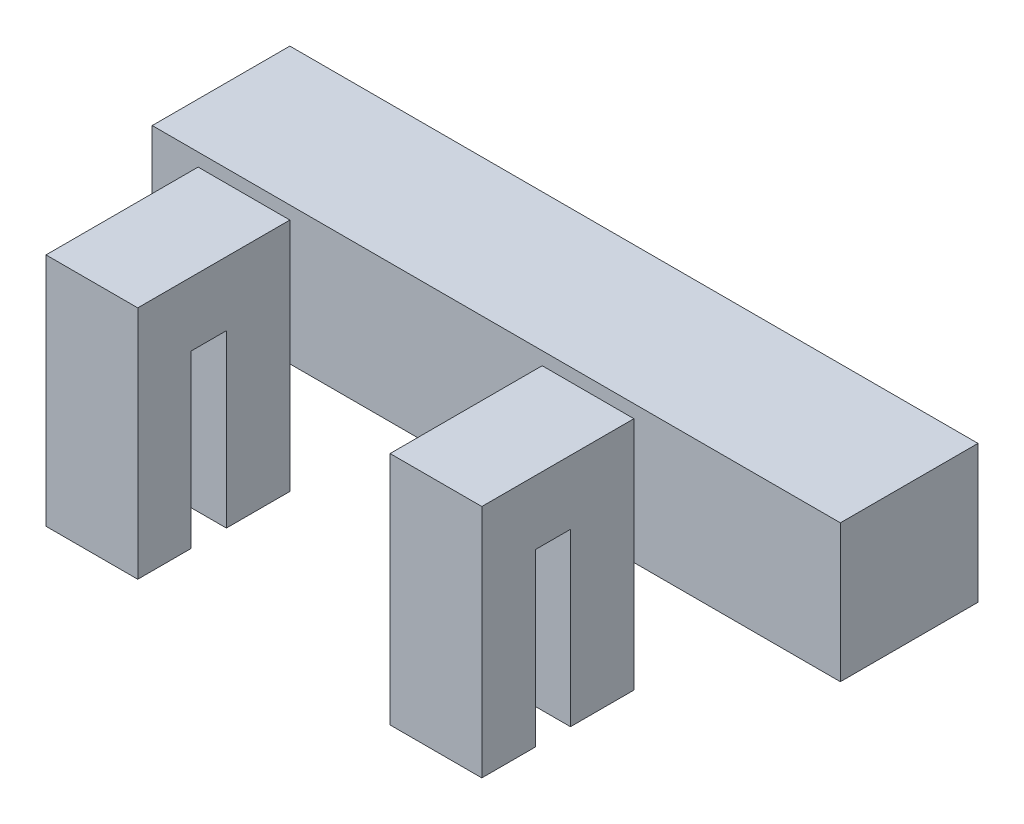
ISO-10303-21;
HEADER;
FILE_DESCRIPTION(('STEP AP214'),'2;1');
FILE_NAME('part.step','',(''),(''),'','','');
FILE_SCHEMA(('AUTOMOTIVE_DESIGN { 1 0 10303 214 1 1 1 1 }'));
ENDSEC;
DATA;
#1=APPLICATION_CONTEXT('core data for automotive mechanical design processes');
#2=APPLICATION_PROTOCOL_DEFINITION('international standard','automotive_design',2000,#1);
#3=PRODUCT_CONTEXT('',#1,'mechanical');
#4=PRODUCT('Part','Part','',(#3));
#5=PRODUCT_RELATED_PRODUCT_CATEGORY('part','',(#4));
#6=PRODUCT_DEFINITION_FORMATION('','',#4);
#7=PRODUCT_DEFINITION_CONTEXT('part definition',#1,'design');
#8=PRODUCT_DEFINITION('design','',#6,#7);
#9=PRODUCT_DEFINITION_SHAPE('','',#8);
#10=(LENGTH_UNIT() NAMED_UNIT(*) SI_UNIT(.MILLI.,.METRE.));
#11=(NAMED_UNIT(*) PLANE_ANGLE_UNIT() SI_UNIT($,.RADIAN.));
#12=(NAMED_UNIT(*) SI_UNIT($,.STERADIAN.) SOLID_ANGLE_UNIT());
#13=UNCERTAINTY_MEASURE_WITH_UNIT(LENGTH_MEASURE(1.E-05),#10,'distance_accuracy_value','');
#14=(GEOMETRIC_REPRESENTATION_CONTEXT(3) GLOBAL_UNCERTAINTY_ASSIGNED_CONTEXT((#13)) GLOBAL_UNIT_ASSIGNED_CONTEXT((#10,
#11,#12)) REPRESENTATION_CONTEXT('',''));
#15=CARTESIAN_POINT('',(0.,0.,0.));
#16=DIRECTION('',(0.,0.,1.));
#17=DIRECTION('',(1.,0.,0.));
#18=AXIS2_PLACEMENT_3D('',#15,#16,#17);
#19=CARTESIAN_POINT('',(0.,0.,30.));
#20=DIRECTION('',(0.,0.,1.));
#21=DIRECTION('',(1.,0.,0.));
#22=AXIS2_PLACEMENT_3D('',#19,#20,#21);
#23=PLANE('',#22);
#24=DIRECTION('',(-1.,0.,0.));
#25=VECTOR('',#24,1.);
#26=CARTESIAN_POINT('',(-45.,27.1581703390217,30.));
#27=LINE('',#26,#25);
#28=CARTESIAN_POINT('',(-45.,27.1581703390217,30.));
#29=VERTEX_POINT('',#28);
#30=CARTESIAN_POINT('',(-65.,27.1581703390217,30.));
#31=VERTEX_POINT('',#30);
#32=EDGE_CURVE('E48',#29,#31,#27,.T.);
#33=ORIENTED_EDGE('',*,*,#32,.F.);
#34=DIRECTION('',(0.,-1.,0.));
#35=VECTOR('',#34,1.);
#36=CARTESIAN_POINT('',(-45.,27.1581703390217,30.));
#37=LINE('',#36,#35);
#38=CARTESIAN_POINT('',(-45.,0.,30.));
#39=VERTEX_POINT('',#38);
#40=EDGE_CURVE('E191',#29,#39,#37,.T.);
#41=ORIENTED_EDGE('',*,*,#40,.T.);
#42=DIRECTION('',(1.,0.,0.));
#43=VECTOR('',#42,1.);
#44=CARTESIAN_POINT('',(0.,0.,30.));
#45=LINE('',#44,#43);
#46=CARTESIAN_POINT('',(0.,0.,30.));
#47=VERTEX_POINT('',#46);
#48=EDGE_CURVE('E333',#39,#47,#45,.T.);
#49=ORIENTED_EDGE('',*,*,#48,.T.);
#50=DIRECTION('',(0.,1.,0.));
#51=VECTOR('',#50,1.);
#52=CARTESIAN_POINT('',(0.,0.,30.));
#53=LINE('',#52,#51);
#54=CARTESIAN_POINT('',(0.,30.,30.));
#55=VERTEX_POINT('',#54);
#56=EDGE_CURVE('E325',#47,#55,#53,.T.);
#57=ORIENTED_EDGE('',*,*,#56,.T.);
#58=DIRECTION('',(-1.,0.,0.));
#59=VECTOR('',#58,1.);
#60=CARTESIAN_POINT('',(0.,30.,30.));
#61=LINE('',#60,#59);
#62=CARTESIAN_POINT('',(-150.,30.,30.));
#63=VERTEX_POINT('',#62);
#64=EDGE_CURVE('E328',#55,#63,#61,.T.);
#65=ORIENTED_EDGE('',*,*,#64,.T.);
#66=DIRECTION('',(0.,-1.,0.));
#67=VECTOR('',#66,1.);
#68=CARTESIAN_POINT('',(-150.,0.,30.));
#69=LINE('',#68,#67);
#70=CARTESIAN_POINT('',(-150.,0.,30.));
#71=VERTEX_POINT('',#70);
#72=EDGE_CURVE('E331',#63,#71,#69,.T.);
#73=ORIENTED_EDGE('',*,*,#72,.T.);
#74=CARTESIAN_POINT('',(-140.,0.,30.));
#75=VERTEX_POINT('',#74);
#76=EDGE_CURVE('E334',#71,#75,#45,.T.);
#77=ORIENTED_EDGE('',*,*,#76,.T.);
#78=DIRECTION('',(0.,-1.,0.));
#79=VECTOR('',#78,1.);
#80=CARTESIAN_POINT('',(-140.,27.1581703390217,30.));
#81=LINE('',#80,#79);
#82=CARTESIAN_POINT('',(-140.,27.1581703390217,30.));
#83=VERTEX_POINT('',#82);
#84=EDGE_CURVE('E284',#83,#75,#81,.T.);
#85=ORIENTED_EDGE('',*,*,#84,.F.);
#86=DIRECTION('',(-1.,0.,0.));
#87=VECTOR('',#86,1.);
#88=CARTESIAN_POINT('',(-120.,27.1581703390217,30.));
#89=LINE('',#88,#87);
#90=CARTESIAN_POINT('',(-120.,27.1581703390217,30.));
#91=VERTEX_POINT('',#90);
#92=EDGE_CURVE('E308',#91,#83,#89,.T.);
#93=ORIENTED_EDGE('',*,*,#92,.F.);
#94=DIRECTION('',(0.,-1.,0.));
#95=VECTOR('',#94,1.);
#96=CARTESIAN_POINT('',(-120.,27.1581703390217,30.));
#97=LINE('',#96,#95);
#98=CARTESIAN_POINT('',(-120.,0.,30.));
#99=VERTEX_POINT('',#98);
#100=EDGE_CURVE('E258',#91,#99,#97,.T.);
#101=ORIENTED_EDGE('',*,*,#100,.T.);
#102=CARTESIAN_POINT('',(-65.,0.,30.));
#103=VERTEX_POINT('',#102);
#104=EDGE_CURVE('E370',#99,#103,#45,.T.);
#105=ORIENTED_EDGE('',*,*,#104,.T.);
#106=DIRECTION('',(0.,-1.,0.));
#107=VECTOR('',#106,1.);
#108=CARTESIAN_POINT('',(-65.,27.1581703390217,30.));
#109=LINE('',#108,#107);
#110=EDGE_CURVE('E53',#31,#103,#109,.T.);
#111=ORIENTED_EDGE('',*,*,#110,.F.);
#112=EDGE_LOOP('',(#33,#41,#49,#57,#65,#73,#77,#85,#93,#101,#105,#111));
#113=FACE_BOUND('',#112,.T.);
#114=ADVANCED_FACE('F33',(#113),#23,.T.);
#115=CARTESIAN_POINT('',(0.,0.,30.));
#116=DIRECTION('',(-1.,0.,0.));
#117=DIRECTION('',(0.,-1.,0.));
#118=AXIS2_PLACEMENT_3D('',#115,#116,#117);
#119=PLANE('',#118);
#120=DIRECTION('',(0.,1.,0.));
#121=VECTOR('',#120,1.);
#122=CARTESIAN_POINT('',(0.,0.,0.));
#123=LINE('',#122,#121);
#124=CARTESIAN_POINT('',(0.,0.,0.));
#125=VERTEX_POINT('',#124);
#126=CARTESIAN_POINT('',(0.,30.,0.));
#127=VERTEX_POINT('',#126);
#128=EDGE_CURVE('E310',#125,#127,#123,.T.);
#129=ORIENTED_EDGE('',*,*,#128,.T.);
#130=DIRECTION('',(0.,0.,-1.));
#131=VECTOR('',#130,1.);
#132=CARTESIAN_POINT('',(0.,30.,30.));
#133=LINE('',#132,#131);
#134=EDGE_CURVE('E11',#55,#127,#133,.T.);
#135=ORIENTED_EDGE('',*,*,#134,.F.);
#136=ORIENTED_EDGE('',*,*,#56,.F.);
#137=DIRECTION('',(0.,0.,-1.));
#138=VECTOR('',#137,1.);
#139=CARTESIAN_POINT('',(0.,0.,30.));
#140=LINE('',#139,#138);
#141=EDGE_CURVE('E337',#47,#125,#140,.T.);
#142=ORIENTED_EDGE('',*,*,#141,.T.);
#143=EDGE_LOOP('',(#129,#135,#136,#142));
#144=FACE_BOUND('',#143,.T.);
#145=ADVANCED_FACE('F35',(#144),#119,.F.);
#146=CARTESIAN_POINT('',(0.,30.,30.));
#147=DIRECTION('',(0.,-1.,0.));
#148=DIRECTION('',(1.,0.,0.));
#149=AXIS2_PLACEMENT_3D('',#146,#147,#148);
#150=PLANE('',#149);
#151=DIRECTION('',(-1.,0.,0.));
#152=VECTOR('',#151,1.);
#153=CARTESIAN_POINT('',(0.,30.,0.));
#154=LINE('',#153,#152);
#155=CARTESIAN_POINT('',(-150.,30.,0.));
#156=VERTEX_POINT('',#155);
#157=EDGE_CURVE('E341',#127,#156,#154,.T.);
#158=ORIENTED_EDGE('',*,*,#157,.T.);
#159=DIRECTION('',(0.,0.,-1.));
#160=VECTOR('',#159,1.);
#161=CARTESIAN_POINT('',(-150.,30.,30.));
#162=LINE('',#161,#160);
#163=EDGE_CURVE('E41',#63,#156,#162,.T.);
#164=ORIENTED_EDGE('',*,*,#163,.F.);
#165=ORIENTED_EDGE('',*,*,#64,.F.);
#166=ORIENTED_EDGE('',*,*,#134,.T.);
#167=EDGE_LOOP('',(#158,#164,#165,#166));
#168=FACE_BOUND('',#167,.T.);
#169=ADVANCED_FACE('F417',(#168),#150,.F.);
#170=CARTESIAN_POINT('',(-150.,0.,30.));
#171=DIRECTION('',(1.,0.,0.));
#172=DIRECTION('',(0.,0.,-1.));
#173=AXIS2_PLACEMENT_3D('',#170,#171,#172);
#174=PLANE('',#173);
#175=DIRECTION('',(0.,-1.,0.));
#176=VECTOR('',#175,1.);
#177=CARTESIAN_POINT('',(-150.,0.,0.));
#178=LINE('',#177,#176);
#179=CARTESIAN_POINT('',(-150.,0.,0.));
#180=VERTEX_POINT('',#179);
#181=EDGE_CURVE('E343',#156,#180,#178,.T.);
#182=ORIENTED_EDGE('',*,*,#181,.T.);
#183=DIRECTION('',(0.,0.,-1.));
#184=VECTOR('',#183,1.);
#185=CARTESIAN_POINT('',(-150.,0.,30.));
#186=LINE('',#185,#184);
#187=EDGE_CURVE('E348',#71,#180,#186,.T.);
#188=ORIENTED_EDGE('',*,*,#187,.F.);
#189=ORIENTED_EDGE('',*,*,#72,.F.);
#190=ORIENTED_EDGE('',*,*,#163,.T.);
#191=EDGE_LOOP('',(#182,#188,#189,#190));
#192=FACE_BOUND('',#191,.T.);
#193=ADVANCED_FACE('F355',(#192),#174,.F.);
#194=CARTESIAN_POINT('',(0.,0.,30.));
#195=DIRECTION('',(0.,1.,0.));
#196=DIRECTION('',(-1.,0.,0.));
#197=AXIS2_PLACEMENT_3D('',#194,#195,#196);
#198=PLANE('',#197);
#199=DIRECTION('',(1.,0.,0.));
#200=VECTOR('',#199,1.);
#201=CARTESIAN_POINT('',(0.,0.,0.));
#202=LINE('',#201,#200);
#203=EDGE_CURVE('E329',#180,#125,#202,.T.);
#204=ORIENTED_EDGE('',*,*,#203,.T.);
#205=ORIENTED_EDGE('',*,*,#141,.F.);
#206=ORIENTED_EDGE('',*,*,#48,.F.);
#207=EDGE_CURVE('E188',#103,#39,#45,.T.);
#208=ORIENTED_EDGE('',*,*,#207,.F.);
#209=ORIENTED_EDGE('',*,*,#104,.F.);
#210=EDGE_CURVE('E338',#75,#99,#45,.T.);
#211=ORIENTED_EDGE('',*,*,#210,.F.);
#212=ORIENTED_EDGE('',*,*,#76,.F.);
#213=ORIENTED_EDGE('',*,*,#187,.T.);
#214=EDGE_LOOP('',(#204,#205,#206,#208,#209,#211,#212,#213));
#215=FACE_BOUND('',#214,.T.);
#216=ADVANCED_FACE('F364',(#215),#198,.F.);
#217=CARTESIAN_POINT('',(0.,0.,0.));
#218=DIRECTION('',(0.,0.,1.));
#219=DIRECTION('',(1.,0.,0.));
#220=AXIS2_PLACEMENT_3D('',#217,#218,#219);
#221=PLANE('',#220);
#222=ORIENTED_EDGE('',*,*,#128,.F.);
#223=ORIENTED_EDGE('',*,*,#203,.F.);
#224=ORIENTED_EDGE('',*,*,#181,.F.);
#225=ORIENTED_EDGE('',*,*,#157,.F.);
#226=EDGE_LOOP('',(#222,#223,#224,#225));
#227=FACE_BOUND('',#226,.T.);
#228=ADVANCED_FACE('F361',(#227),#221,.F.);
#229=CARTESIAN_POINT('',(-120.,27.1581703390217,30.));
#230=DIRECTION('',(0.,0.,-1.));
#231=DIRECTION('',(-1.,0.,0.));
#232=AXIS2_PLACEMENT_3D('',#229,#230,#231);
#233=PLANE('',#232);
#234=CARTESIAN_POINT('',(-140.,-24.0798332325672,30.));
#235=VERTEX_POINT('',#234);
#236=EDGE_CURVE('E246',#75,#235,#81,.T.);
#237=ORIENTED_EDGE('',*,*,#236,.F.);
#238=ORIENTED_EDGE('',*,*,#210,.T.);
#239=CARTESIAN_POINT('',(-120.,-24.0798332325672,30.));
#240=VERTEX_POINT('',#239);
#241=EDGE_CURVE('E262',#99,#240,#97,.T.);
#242=ORIENTED_EDGE('',*,*,#241,.T.);
#243=DIRECTION('',(-1.,0.,0.));
#244=VECTOR('',#243,1.);
#245=CARTESIAN_POINT('',(-120.,-24.0798332325672,30.));
#246=LINE('',#245,#244);
#247=EDGE_CURVE('E283',#240,#235,#246,.T.);
#248=ORIENTED_EDGE('',*,*,#247,.T.);
#249=EDGE_LOOP('',(#237,#238,#242,#248));
#250=FACE_BOUND('',#249,.T.);
#251=ADVANCED_FACE('F375',(#250),#233,.T.);
#252=CARTESIAN_POINT('',(-120.,27.1581703390217,30.));
#253=DIRECTION('',(0.,1.,0.));
#254=DIRECTION('',(0.,0.,1.));
#255=AXIS2_PLACEMENT_3D('',#252,#253,#254);
#256=PLANE('',#255);
#257=DIRECTION('',(0.,0.,-1.));
#258=VECTOR('',#257,1.);
#259=CARTESIAN_POINT('',(-140.,27.1581703390217,30.));
#260=LINE('',#259,#258);
#261=CARTESIAN_POINT('',(-140.,27.1581703390217,63.1561933360463));
#262=VERTEX_POINT('',#261);
#263=EDGE_CURVE('E305',#262,#83,#260,.T.);
#264=ORIENTED_EDGE('',*,*,#263,.F.);
#265=DIRECTION('',(-1.,0.,0.));
#266=VECTOR('',#265,1.);
#267=CARTESIAN_POINT('',(-120.,27.1581703390217,63.1561933360463));
#268=LINE('',#267,#266);
#269=CARTESIAN_POINT('',(-120.,27.1581703390217,63.1561933360463));
#270=VERTEX_POINT('',#269);
#271=EDGE_CURVE('E311',#270,#262,#268,.T.);
#272=ORIENTED_EDGE('',*,*,#271,.F.);
#273=DIRECTION('',(0.,0.,-1.));
#274=VECTOR('',#273,1.);
#275=CARTESIAN_POINT('',(-120.,27.1581703390217,30.));
#276=LINE('',#275,#274);
#277=EDGE_CURVE('E280',#270,#91,#276,.T.);
#278=ORIENTED_EDGE('',*,*,#277,.T.);
#279=ORIENTED_EDGE('',*,*,#92,.T.);
#280=EDGE_LOOP('',(#264,#272,#278,#279));
#281=FACE_BOUND('',#280,.T.);
#282=ADVANCED_FACE('F450',(#281),#256,.T.);
#283=CARTESIAN_POINT('',(-120.,27.1581703390217,63.1561933360463));
#284=DIRECTION('',(0.,0.,1.));
#285=DIRECTION('',(1.,0.,0.));
#286=AXIS2_PLACEMENT_3D('',#283,#284,#285);
#287=PLANE('',#286);
#288=DIRECTION('',(0.,1.,0.));
#289=VECTOR('',#288,1.);
#290=CARTESIAN_POINT('',(-140.,27.1581703390217,63.1561933360463));
#291=LINE('',#290,#289);
#292=CARTESIAN_POINT('',(-140.,-24.0798332325672,63.1561933360463));
#293=VERTEX_POINT('',#292);
#294=EDGE_CURVE('E302',#293,#262,#291,.T.);
#295=ORIENTED_EDGE('',*,*,#294,.F.);
#296=DIRECTION('',(-1.,0.,0.));
#297=VECTOR('',#296,1.);
#298=CARTESIAN_POINT('',(-120.,-24.0798332325672,63.1561933360463));
#299=LINE('',#298,#297);
#300=CARTESIAN_POINT('',(-120.,-24.0798332325672,63.1561933360463));
#301=VERTEX_POINT('',#300);
#302=EDGE_CURVE('E313',#301,#293,#299,.T.);
#303=ORIENTED_EDGE('',*,*,#302,.F.);
#304=DIRECTION('',(0.,1.,0.));
#305=VECTOR('',#304,1.);
#306=CARTESIAN_POINT('',(-120.,27.1581703390217,63.1561933360463));
#307=LINE('',#306,#305);
#308=EDGE_CURVE('E277',#301,#270,#307,.T.);
#309=ORIENTED_EDGE('',*,*,#308,.T.);
#310=ORIENTED_EDGE('',*,*,#271,.T.);
#311=EDGE_LOOP('',(#295,#303,#309,#310));
#312=FACE_BOUND('',#311,.T.);
#313=ADVANCED_FACE('F456',(#312),#287,.T.);
#314=CARTESIAN_POINT('',(-120.,-24.0798332325672,51.5046134278178));
#315=DIRECTION('',(0.,-1.,0.));
#316=DIRECTION('',(0.,0.,-1.));
#317=AXIS2_PLACEMENT_3D('',#314,#315,#316);
#318=PLANE('',#317);
#319=DIRECTION('',(0.,0.,1.));
#320=VECTOR('',#319,1.);
#321=CARTESIAN_POINT('',(-140.,-24.0798332325672,51.5046134278178));
#322=LINE('',#321,#320);
#323=CARTESIAN_POINT('',(-140.,-24.0798332325672,51.5046134278178));
#324=VERTEX_POINT('',#323);
#325=EDGE_CURVE('E299',#324,#293,#322,.T.);
#326=ORIENTED_EDGE('',*,*,#325,.F.);
#327=DIRECTION('',(-1.,0.,0.));
#328=VECTOR('',#327,1.);
#329=CARTESIAN_POINT('',(-120.,-24.0798332325672,51.5046134278178));
#330=LINE('',#329,#328);
#331=CARTESIAN_POINT('',(-120.,-24.0798332325672,51.5046134278178));
#332=VERTEX_POINT('',#331);
#333=EDGE_CURVE('E315',#332,#324,#330,.T.);
#334=ORIENTED_EDGE('',*,*,#333,.F.);
#335=DIRECTION('',(0.,0.,1.));
#336=VECTOR('',#335,1.);
#337=CARTESIAN_POINT('',(-120.,-24.0798332325672,51.5046134278178));
#338=LINE('',#337,#336);
#339=EDGE_CURVE('E274',#332,#301,#338,.T.);
#340=ORIENTED_EDGE('',*,*,#339,.T.);
#341=ORIENTED_EDGE('',*,*,#302,.T.);
#342=EDGE_LOOP('',(#326,#334,#340,#341));
#343=FACE_BOUND('',#342,.T.);
#344=ADVANCED_FACE('F464',(#343),#318,.T.);
#345=CARTESIAN_POINT('',(-120.,-24.0798332325672,51.5046134278178));
#346=DIRECTION('',(0.,0.,-1.));
#347=DIRECTION('',(-1.,0.,0.));
#348=AXIS2_PLACEMENT_3D('',#345,#346,#347);
#349=PLANE('',#348);
#350=DIRECTION('',(0.,-1.,0.));
#351=VECTOR('',#350,1.);
#352=CARTESIAN_POINT('',(-140.,-24.0798332325672,51.5046134278178));
#353=LINE('',#352,#351);
#354=CARTESIAN_POINT('',(-140.,13.1907484614558,51.5046134278178));
#355=VERTEX_POINT('',#354);
#356=EDGE_CURVE('E296',#355,#324,#353,.T.);
#357=ORIENTED_EDGE('',*,*,#356,.F.);
#358=DIRECTION('',(-1.,0.,0.));
#359=VECTOR('',#358,1.);
#360=CARTESIAN_POINT('',(-120.,13.1907484614558,51.5046134278178));
#361=LINE('',#360,#359);
#362=CARTESIAN_POINT('',(-120.,13.1907484614558,51.5046134278178));
#363=VERTEX_POINT('',#362);
#364=EDGE_CURVE('E317',#363,#355,#361,.T.);
#365=ORIENTED_EDGE('',*,*,#364,.F.);
#366=DIRECTION('',(0.,-1.,0.));
#367=VECTOR('',#366,1.);
#368=CARTESIAN_POINT('',(-120.,-24.0798332325672,51.5046134278178));
#369=LINE('',#368,#367);
#370=EDGE_CURVE('E271',#363,#332,#369,.T.);
#371=ORIENTED_EDGE('',*,*,#370,.T.);
#372=ORIENTED_EDGE('',*,*,#333,.T.);
#373=EDGE_LOOP('',(#357,#365,#371,#372));
#374=FACE_BOUND('',#373,.T.);
#375=ADVANCED_FACE('F472',(#374),#349,.T.);
#376=CARTESIAN_POINT('',(-120.,13.1907484614558,43.8333869043878));
#377=DIRECTION('',(0.,-1.,0.));
#378=DIRECTION('',(0.,0.,-1.));
#379=AXIS2_PLACEMENT_3D('',#376,#377,#378);
#380=PLANE('',#379);
#381=DIRECTION('',(0.,0.,1.));
#382=VECTOR('',#381,1.);
#383=CARTESIAN_POINT('',(-140.,13.1907484614558,43.8333869043878));
#384=LINE('',#383,#382);
#385=CARTESIAN_POINT('',(-140.,13.1907484614558,43.8333869043878));
#386=VERTEX_POINT('',#385);
#387=EDGE_CURVE('E293',#386,#355,#384,.T.);
#388=ORIENTED_EDGE('',*,*,#387,.F.);
#389=DIRECTION('',(-1.,0.,0.));
#390=VECTOR('',#389,1.);
#391=CARTESIAN_POINT('',(-120.,13.1907484614558,43.8333869043878));
#392=LINE('',#391,#390);
#393=CARTESIAN_POINT('',(-120.,13.1907484614558,43.8333869043878));
#394=VERTEX_POINT('',#393);
#395=EDGE_CURVE('E319',#394,#386,#392,.T.);
#396=ORIENTED_EDGE('',*,*,#395,.F.);
#397=DIRECTION('',(0.,0.,1.));
#398=VECTOR('',#397,1.);
#399=CARTESIAN_POINT('',(-120.,13.1907484614558,43.8333869043878));
#400=LINE('',#399,#398);
#401=EDGE_CURVE('E268',#394,#363,#400,.T.);
#402=ORIENTED_EDGE('',*,*,#401,.T.);
#403=ORIENTED_EDGE('',*,*,#364,.T.);
#404=EDGE_LOOP('',(#388,#396,#402,#403));
#405=FACE_BOUND('',#404,.T.);
#406=ADVANCED_FACE('F480',(#405),#380,.T.);
#407=CARTESIAN_POINT('',(-120.,-24.0798332325672,43.8333869043878));
#408=DIRECTION('',(0.,0.,1.));
#409=DIRECTION('',(1.,0.,0.));
#410=AXIS2_PLACEMENT_3D('',#407,#408,#409);
#411=PLANE('',#410);
#412=DIRECTION('',(0.,1.,0.));
#413=VECTOR('',#412,1.);
#414=CARTESIAN_POINT('',(-140.,-24.0798332325672,43.8333869043878));
#415=LINE('',#414,#413);
#416=CARTESIAN_POINT('',(-140.,-24.0798332325672,43.8333869043878));
#417=VERTEX_POINT('',#416);
#418=EDGE_CURVE('E290',#417,#386,#415,.T.);
#419=ORIENTED_EDGE('',*,*,#418,.F.);
#420=DIRECTION('',(-1.,0.,0.));
#421=VECTOR('',#420,1.);
#422=CARTESIAN_POINT('',(-120.,-24.0798332325672,43.8333869043878));
#423=LINE('',#422,#421);
#424=CARTESIAN_POINT('',(-120.,-24.0798332325672,43.8333869043878));
#425=VERTEX_POINT('',#424);
#426=EDGE_CURVE('E321',#425,#417,#423,.T.);
#427=ORIENTED_EDGE('',*,*,#426,.F.);
#428=DIRECTION('',(0.,1.,0.));
#429=VECTOR('',#428,1.);
#430=CARTESIAN_POINT('',(-120.,-24.0798332325672,43.8333869043878));
#431=LINE('',#430,#429);
#432=EDGE_CURVE('E265',#425,#394,#431,.T.);
#433=ORIENTED_EDGE('',*,*,#432,.T.);
#434=ORIENTED_EDGE('',*,*,#395,.T.);
#435=EDGE_LOOP('',(#419,#427,#433,#434));
#436=FACE_BOUND('',#435,.T.);
#437=ADVANCED_FACE('F488',(#436),#411,.T.);
#438=CARTESIAN_POINT('',(-120.,-24.0798332325672,30.));
#439=DIRECTION('',(0.,-1.,0.));
#440=DIRECTION('',(0.,0.,-1.));
#441=AXIS2_PLACEMENT_3D('',#438,#439,#440);
#442=PLANE('',#441);
#443=DIRECTION('',(0.,0.,1.));
#444=VECTOR('',#443,1.);
#445=CARTESIAN_POINT('',(-140.,-24.0798332325672,30.));
#446=LINE('',#445,#444);
#447=EDGE_CURVE('E287',#235,#417,#446,.T.);
#448=ORIENTED_EDGE('',*,*,#447,.F.);
#449=ORIENTED_EDGE('',*,*,#247,.F.);
#450=DIRECTION('',(0.,0.,1.));
#451=VECTOR('',#450,1.);
#452=CARTESIAN_POINT('',(-120.,-24.0798332325672,30.));
#453=LINE('',#452,#451);
#454=EDGE_CURVE('E261',#240,#425,#453,.T.);
#455=ORIENTED_EDGE('',*,*,#454,.T.);
#456=ORIENTED_EDGE('',*,*,#426,.T.);
#457=EDGE_LOOP('',(#448,#449,#455,#456));
#458=FACE_BOUND('',#457,.T.);
#459=ADVANCED_FACE('F496',(#458),#442,.T.);
#460=CARTESIAN_POINT('',(-120.,0.,0.));
#461=DIRECTION('',(-1.,0.,0.));
#462=DIRECTION('',(0.,0.,1.));
#463=AXIS2_PLACEMENT_3D('',#460,#461,#462);
#464=PLANE('',#463);
#465=ORIENTED_EDGE('',*,*,#100,.F.);
#466=ORIENTED_EDGE('',*,*,#277,.F.);
#467=ORIENTED_EDGE('',*,*,#308,.F.);
#468=ORIENTED_EDGE('',*,*,#339,.F.);
#469=ORIENTED_EDGE('',*,*,#370,.F.);
#470=ORIENTED_EDGE('',*,*,#401,.F.);
#471=ORIENTED_EDGE('',*,*,#432,.F.);
#472=ORIENTED_EDGE('',*,*,#454,.F.);
#473=ORIENTED_EDGE('',*,*,#241,.F.);
#474=EDGE_LOOP('',(#465,#466,#467,#468,#469,#470,#471,#472,#473));
#475=FACE_BOUND('',#474,.T.);
#476=ADVANCED_FACE('F504',(#475),#464,.F.);
#477=CARTESIAN_POINT('',(-140.,0.,0.));
#478=DIRECTION('',(-1.,0.,0.));
#479=DIRECTION('',(0.,0.,1.));
#480=AXIS2_PLACEMENT_3D('',#477,#478,#479);
#481=PLANE('',#480);
#482=ORIENTED_EDGE('',*,*,#84,.T.);
#483=ORIENTED_EDGE('',*,*,#236,.T.);
#484=ORIENTED_EDGE('',*,*,#447,.T.);
#485=ORIENTED_EDGE('',*,*,#418,.T.);
#486=ORIENTED_EDGE('',*,*,#387,.T.);
#487=ORIENTED_EDGE('',*,*,#356,.T.);
#488=ORIENTED_EDGE('',*,*,#325,.T.);
#489=ORIENTED_EDGE('',*,*,#294,.T.);
#490=ORIENTED_EDGE('',*,*,#263,.T.);
#491=EDGE_LOOP('',(#482,#483,#484,#485,#486,#487,#488,#489,#490));
#492=FACE_BOUND('',#491,.T.);
#493=ADVANCED_FACE('F511',(#492),#481,.T.);
#494=CARTESIAN_POINT('',(-45.,27.1581703390217,30.));
#495=DIRECTION('',(0.,0.,-1.));
#496=DIRECTION('',(-1.,0.,0.));
#497=AXIS2_PLACEMENT_3D('',#494,#495,#496);
#498=PLANE('',#497);
#499=ORIENTED_EDGE('',*,*,#207,.T.);
#500=CARTESIAN_POINT('',(-45.,-24.0798332325672,30.));
#501=VERTEX_POINT('',#500);
#502=EDGE_CURVE('E181',#39,#501,#37,.T.);
#503=ORIENTED_EDGE('',*,*,#502,.T.);
#504=DIRECTION('',(-1.,0.,0.));
#505=VECTOR('',#504,1.);
#506=CARTESIAN_POINT('',(-45.,-24.0798332325672,30.));
#507=LINE('',#506,#505);
#508=CARTESIAN_POINT('',(-65.,-24.0798332325672,30.));
#509=VERTEX_POINT('',#508);
#510=EDGE_CURVE('E185',#501,#509,#507,.T.);
#511=ORIENTED_EDGE('',*,*,#510,.T.);
#512=EDGE_CURVE('E226',#103,#509,#109,.T.);
#513=ORIENTED_EDGE('',*,*,#512,.F.);
#514=EDGE_LOOP('',(#499,#503,#511,#513));
#515=FACE_BOUND('',#514,.T.);
#516=ADVANCED_FACE('F183',(#515),#498,.T.);
#517=CARTESIAN_POINT('',(-45.,27.1581703390217,30.));
#518=DIRECTION('',(0.,1.,0.));
#519=DIRECTION('',(0.,0.,1.));
#520=AXIS2_PLACEMENT_3D('',#517,#518,#519);
#521=PLANE('',#520);
#522=DIRECTION('',(0.,0.,-1.));
#523=VECTOR('',#522,1.);
#524=CARTESIAN_POINT('',(-65.,27.1581703390217,30.));
#525=LINE('',#524,#523);
#526=CARTESIAN_POINT('',(-65.,27.1581703390217,63.1561933360463));
#527=VERTEX_POINT('',#526);
#528=EDGE_CURVE('E192',#527,#31,#525,.T.);
#529=ORIENTED_EDGE('',*,*,#528,.F.);
#530=DIRECTION('',(-1.,0.,0.));
#531=VECTOR('',#530,1.);
#532=CARTESIAN_POINT('',(-45.,27.1581703390217,63.1561933360463));
#533=LINE('',#532,#531);
#534=CARTESIAN_POINT('',(-45.,27.1581703390217,63.1561933360463));
#535=VERTEX_POINT('',#534);
#536=EDGE_CURVE('E247',#535,#527,#533,.T.);
#537=ORIENTED_EDGE('',*,*,#536,.F.);
#538=DIRECTION('',(0.,0.,-1.));
#539=VECTOR('',#538,1.);
#540=CARTESIAN_POINT('',(-45.,27.1581703390217,30.));
#541=LINE('',#540,#539);
#542=EDGE_CURVE('E201',#535,#29,#541,.T.);
#543=ORIENTED_EDGE('',*,*,#542,.T.);
#544=ORIENTED_EDGE('',*,*,#32,.T.);
#545=EDGE_LOOP('',(#529,#537,#543,#544));
#546=FACE_BOUND('',#545,.T.);
#547=ADVANCED_FACE('F386',(#546),#521,.T.);
#548=CARTESIAN_POINT('',(-45.,27.1581703390217,63.1561933360463));
#549=DIRECTION('',(0.,0.,1.));
#550=DIRECTION('',(1.,0.,0.));
#551=AXIS2_PLACEMENT_3D('',#548,#549,#550);
#552=PLANE('',#551);
#553=DIRECTION('',(0.,1.,0.));
#554=VECTOR('',#553,1.);
#555=CARTESIAN_POINT('',(-65.,27.1581703390217,63.1561933360463));
#556=LINE('',#555,#554);
#557=CARTESIAN_POINT('',(-65.,-24.0798332325672,63.1561933360463));
#558=VERTEX_POINT('',#557);
#559=EDGE_CURVE('E240',#558,#527,#556,.T.);
#560=ORIENTED_EDGE('',*,*,#559,.F.);
#561=DIRECTION('',(-1.,0.,0.));
#562=VECTOR('',#561,1.);
#563=CARTESIAN_POINT('',(-45.,-24.0798332325672,63.1561933360463));
#564=LINE('',#563,#562);
#565=CARTESIAN_POINT('',(-45.,-24.0798332325672,63.1561933360463));
#566=VERTEX_POINT('',#565);
#567=EDGE_CURVE('E249',#566,#558,#564,.T.);
#568=ORIENTED_EDGE('',*,*,#567,.F.);
#569=DIRECTION('',(0.,1.,0.));
#570=VECTOR('',#569,1.);
#571=CARTESIAN_POINT('',(-45.,27.1581703390217,63.1561933360463));
#572=LINE('',#571,#570);
#573=EDGE_CURVE('E220',#566,#535,#572,.T.);
#574=ORIENTED_EDGE('',*,*,#573,.T.);
#575=ORIENTED_EDGE('',*,*,#536,.T.);
#576=EDGE_LOOP('',(#560,#568,#574,#575));
#577=FACE_BOUND('',#576,.T.);
#578=ADVANCED_FACE('F530',(#577),#552,.T.);
#579=CARTESIAN_POINT('',(-45.,-24.0798332325672,51.5046134278178));
#580=DIRECTION('',(0.,-1.,0.));
#581=DIRECTION('',(0.,0.,-1.));
#582=AXIS2_PLACEMENT_3D('',#579,#580,#581);
#583=PLANE('',#582);
#584=DIRECTION('',(0.,0.,1.));
#585=VECTOR('',#584,1.);
#586=CARTESIAN_POINT('',(-65.,-24.0798332325672,51.5046134278178));
#587=LINE('',#586,#585);
#588=CARTESIAN_POINT('',(-65.,-24.0798332325672,51.5046134278178));
#589=VERTEX_POINT('',#588);
#590=EDGE_CURVE('E237',#589,#558,#587,.T.);
#591=ORIENTED_EDGE('',*,*,#590,.F.);
#592=DIRECTION('',(-1.,0.,0.));
#593=VECTOR('',#592,1.);
#594=CARTESIAN_POINT('',(-45.,-24.0798332325672,51.5046134278178));
#595=LINE('',#594,#593);
#596=CARTESIAN_POINT('',(-45.,-24.0798332325672,51.5046134278178));
#597=VERTEX_POINT('',#596);
#598=EDGE_CURVE('E251',#597,#589,#595,.T.);
#599=ORIENTED_EDGE('',*,*,#598,.F.);
#600=DIRECTION('',(0.,0.,1.));
#601=VECTOR('',#600,1.);
#602=CARTESIAN_POINT('',(-45.,-24.0798332325672,51.5046134278178));
#603=LINE('',#602,#601);
#604=EDGE_CURVE('E217',#597,#566,#603,.T.);
#605=ORIENTED_EDGE('',*,*,#604,.T.);
#606=ORIENTED_EDGE('',*,*,#567,.T.);
#607=EDGE_LOOP('',(#591,#599,#605,#606));
#608=FACE_BOUND('',#607,.T.);
#609=ADVANCED_FACE('F394',(#608),#583,.T.);
#610=CARTESIAN_POINT('',(-45.,-24.0798332325672,51.5046134278178));
#611=DIRECTION('',(0.,0.,-1.));
#612=DIRECTION('',(-1.,0.,0.));
#613=AXIS2_PLACEMENT_3D('',#610,#611,#612);
#614=PLANE('',#613);
#615=DIRECTION('',(0.,-1.,0.));
#616=VECTOR('',#615,1.);
#617=CARTESIAN_POINT('',(-65.,-24.0798332325672,51.5046134278178));
#618=LINE('',#617,#616);
#619=CARTESIAN_POINT('',(-65.,13.1907484614558,51.5046134278178));
#620=VERTEX_POINT('',#619);
#621=EDGE_CURVE('E234',#620,#589,#618,.T.);
#622=ORIENTED_EDGE('',*,*,#621,.F.);
#623=DIRECTION('',(-1.,0.,0.));
#624=VECTOR('',#623,1.);
#625=CARTESIAN_POINT('',(-45.,13.1907484614558,51.5046134278178));
#626=LINE('',#625,#624);
#627=CARTESIAN_POINT('',(-45.,13.1907484614558,51.5046134278178));
#628=VERTEX_POINT('',#627);
#629=EDGE_CURVE('E253',#628,#620,#626,.T.);
#630=ORIENTED_EDGE('',*,*,#629,.F.);
#631=DIRECTION('',(0.,-1.,0.));
#632=VECTOR('',#631,1.);
#633=CARTESIAN_POINT('',(-45.,-24.0798332325672,51.5046134278178));
#634=LINE('',#633,#632);
#635=EDGE_CURVE('E214',#628,#597,#634,.T.);
#636=ORIENTED_EDGE('',*,*,#635,.T.);
#637=ORIENTED_EDGE('',*,*,#598,.T.);
#638=EDGE_LOOP('',(#622,#630,#636,#637));
#639=FACE_BOUND('',#638,.T.);
#640=ADVANCED_FACE('F397',(#639),#614,.T.);
#641=CARTESIAN_POINT('',(-45.,13.1907484614558,43.8333869043878));
#642=DIRECTION('',(0.,-1.,0.));
#643=DIRECTION('',(0.,0.,-1.));
#644=AXIS2_PLACEMENT_3D('',#641,#642,#643);
#645=PLANE('',#644);
#646=DIRECTION('',(0.,0.,1.));
#647=VECTOR('',#646,1.);
#648=CARTESIAN_POINT('',(-65.,13.1907484614558,43.8333869043878));
#649=LINE('',#648,#647);
#650=CARTESIAN_POINT('',(-65.,13.1907484614558,43.8333869043878));
#651=VERTEX_POINT('',#650);
#652=EDGE_CURVE('E231',#651,#620,#649,.T.);
#653=ORIENTED_EDGE('',*,*,#652,.F.);
#654=DIRECTION('',(-1.,0.,0.));
#655=VECTOR('',#654,1.);
#656=CARTESIAN_POINT('',(-45.,13.1907484614558,43.8333869043878));
#657=LINE('',#656,#655);
#658=CARTESIAN_POINT('',(-45.,13.1907484614558,43.8333869043878));
#659=VERTEX_POINT('',#658);
#660=EDGE_CURVE('E255',#659,#651,#657,.T.);
#661=ORIENTED_EDGE('',*,*,#660,.F.);
#662=DIRECTION('',(0.,0.,1.));
#663=VECTOR('',#662,1.);
#664=CARTESIAN_POINT('',(-45.,13.1907484614558,43.8333869043878));
#665=LINE('',#664,#663);
#666=EDGE_CURVE('E209',#659,#628,#665,.T.);
#667=ORIENTED_EDGE('',*,*,#666,.T.);
#668=ORIENTED_EDGE('',*,*,#629,.T.);
#669=EDGE_LOOP('',(#653,#661,#667,#668));
#670=FACE_BOUND('',#669,.T.);
#671=ADVANCED_FACE('F400',(#670),#645,.T.);
#672=CARTESIAN_POINT('',(-45.,-24.0798332325672,43.8333869043878));
#673=DIRECTION('',(0.,0.,1.));
#674=DIRECTION('',(1.,0.,0.));
#675=AXIS2_PLACEMENT_3D('',#672,#673,#674);
#676=PLANE('',#675);
#677=DIRECTION('',(0.,1.,0.));
#678=VECTOR('',#677,1.);
#679=CARTESIAN_POINT('',(-65.,-24.0798332325672,43.8333869043878));
#680=LINE('',#679,#678);
#681=CARTESIAN_POINT('',(-65.,-24.0798332325672,43.8333869043878));
#682=VERTEX_POINT('',#681);
#683=EDGE_CURVE('E228',#682,#651,#680,.T.);
#684=ORIENTED_EDGE('',*,*,#683,.F.);
#685=DIRECTION('',(-1.,0.,0.));
#686=VECTOR('',#685,1.);
#687=CARTESIAN_POINT('',(-45.,-24.0798332325672,43.8333869043878));
#688=LINE('',#687,#686);
#689=CARTESIAN_POINT('',(-45.,-24.0798332325672,43.8333869043878));
#690=VERTEX_POINT('',#689);
#691=EDGE_CURVE('E200',#690,#682,#688,.T.);
#692=ORIENTED_EDGE('',*,*,#691,.F.);
#693=DIRECTION('',(0.,1.,0.));
#694=VECTOR('',#693,1.);
#695=CARTESIAN_POINT('',(-45.,-24.0798332325672,43.8333869043878));
#696=LINE('',#695,#694);
#697=EDGE_CURVE('E207',#690,#659,#696,.T.);
#698=ORIENTED_EDGE('',*,*,#697,.T.);
#699=ORIENTED_EDGE('',*,*,#660,.T.);
#700=EDGE_LOOP('',(#684,#692,#698,#699));
#701=FACE_BOUND('',#700,.T.);
#702=ADVANCED_FACE('F403',(#701),#676,.T.);
#703=CARTESIAN_POINT('',(-45.,-24.0798332325672,30.));
#704=DIRECTION('',(0.,-1.,0.));
#705=DIRECTION('',(0.,0.,-1.));
#706=AXIS2_PLACEMENT_3D('',#703,#704,#705);
#707=PLANE('',#706);
#708=DIRECTION('',(0.,0.,1.));
#709=VECTOR('',#708,1.);
#710=CARTESIAN_POINT('',(-65.,-24.0798332325672,30.));
#711=LINE('',#710,#709);
#712=EDGE_CURVE('E199',#509,#682,#711,.T.);
#713=ORIENTED_EDGE('',*,*,#712,.F.);
#714=ORIENTED_EDGE('',*,*,#510,.F.);
#715=DIRECTION('',(0.,0.,1.));
#716=VECTOR('',#715,1.);
#717=CARTESIAN_POINT('',(-45.,-24.0798332325672,30.));
#718=LINE('',#717,#716);
#719=EDGE_CURVE('E197',#501,#690,#718,.T.);
#720=ORIENTED_EDGE('',*,*,#719,.T.);
#721=ORIENTED_EDGE('',*,*,#691,.T.);
#722=EDGE_LOOP('',(#713,#714,#720,#721));
#723=FACE_BOUND('',#722,.T.);
#724=ADVANCED_FACE('F196',(#723),#707,.T.);
#725=CARTESIAN_POINT('',(-45.,0.,0.));
#726=DIRECTION('',(-1.,0.,0.));
#727=DIRECTION('',(0.,0.,1.));
#728=AXIS2_PLACEMENT_3D('',#725,#726,#727);
#729=PLANE('',#728);
#730=ORIENTED_EDGE('',*,*,#40,.F.);
#731=ORIENTED_EDGE('',*,*,#542,.F.);
#732=ORIENTED_EDGE('',*,*,#573,.F.);
#733=ORIENTED_EDGE('',*,*,#604,.F.);
#734=ORIENTED_EDGE('',*,*,#635,.F.);
#735=ORIENTED_EDGE('',*,*,#666,.F.);
#736=ORIENTED_EDGE('',*,*,#697,.F.);
#737=ORIENTED_EDGE('',*,*,#719,.F.);
#738=ORIENTED_EDGE('',*,*,#502,.F.);
#739=EDGE_LOOP('',(#730,#731,#732,#733,#734,#735,#736,#737,#738));
#740=FACE_BOUND('',#739,.T.);
#741=ADVANCED_FACE('F204',(#740),#729,.F.);
#742=CARTESIAN_POINT('',(-65.,0.,0.));
#743=DIRECTION('',(-1.,0.,0.));
#744=DIRECTION('',(0.,0.,1.));
#745=AXIS2_PLACEMENT_3D('',#742,#743,#744);
#746=PLANE('',#745);
#747=ORIENTED_EDGE('',*,*,#110,.T.);
#748=ORIENTED_EDGE('',*,*,#512,.T.);
#749=ORIENTED_EDGE('',*,*,#712,.T.);
#750=ORIENTED_EDGE('',*,*,#683,.T.);
#751=ORIENTED_EDGE('',*,*,#652,.T.);
#752=ORIENTED_EDGE('',*,*,#621,.T.);
#753=ORIENTED_EDGE('',*,*,#590,.T.);
#754=ORIENTED_EDGE('',*,*,#559,.T.);
#755=ORIENTED_EDGE('',*,*,#528,.T.);
#756=EDGE_LOOP('',(#747,#748,#749,#750,#751,#752,#753,#754,#755));
#757=FACE_BOUND('',#756,.T.);
#758=ADVANCED_FACE('F382',(#757),#746,.T.);
#759=CLOSED_SHELL('',(#114,#145,#169,#193,#216,#228,#251,#282,#313,#344,#375,#406,#437,#459,
#476,#493,#516,#547,#578,#609,#640,#671,#702,#724,#741,#758));
#760=MANIFOLD_SOLID_BREP('B2',#759);
#761=ADVANCED_BREP_SHAPE_REPRESENTATION('',(#18,#760),#14);
#762=SHAPE_DEFINITION_REPRESENTATION(#9,#761);
ENDSEC;
END-ISO-10303-21;
